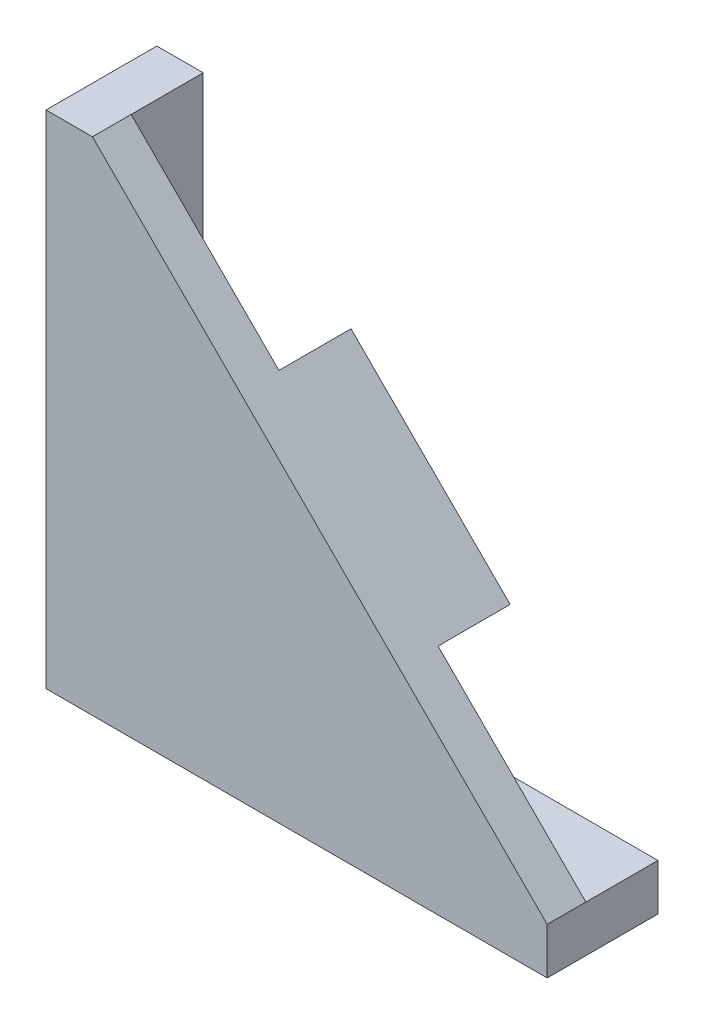
ISO-10303-21;
HEADER;
FILE_DESCRIPTION(('STEP AP214'),'2;1');
FILE_NAME('part.step','',(''),(''),'','','');
FILE_SCHEMA(('AUTOMOTIVE_DESIGN { 1 0 10303 214 1 1 1 1 }'));
ENDSEC;
DATA;
#1=APPLICATION_CONTEXT('core data for automotive mechanical design processes');
#2=APPLICATION_PROTOCOL_DEFINITION('international standard','automotive_design',2000,#1);
#3=PRODUCT_CONTEXT('',#1,'mechanical');
#4=PRODUCT('Part','Part','',(#3));
#5=PRODUCT_RELATED_PRODUCT_CATEGORY('part','',(#4));
#6=PRODUCT_DEFINITION_FORMATION('','',#4);
#7=PRODUCT_DEFINITION_CONTEXT('part definition',#1,'design');
#8=PRODUCT_DEFINITION('design','',#6,#7);
#9=PRODUCT_DEFINITION_SHAPE('','',#8);
#10=(LENGTH_UNIT() NAMED_UNIT(*) SI_UNIT(.MILLI.,.METRE.));
#11=(NAMED_UNIT(*) PLANE_ANGLE_UNIT() SI_UNIT($,.RADIAN.));
#12=(NAMED_UNIT(*) SI_UNIT($,.STERADIAN.) SOLID_ANGLE_UNIT());
#13=UNCERTAINTY_MEASURE_WITH_UNIT(LENGTH_MEASURE(1.E-05),#10,'distance_accuracy_value','');
#14=(GEOMETRIC_REPRESENTATION_CONTEXT(3) GLOBAL_UNCERTAINTY_ASSIGNED_CONTEXT((#13)) GLOBAL_UNIT_ASSIGNED_CONTEXT((#10,
#11,#12)) REPRESENTATION_CONTEXT('',''));
#15=CARTESIAN_POINT('',(0.,0.,0.));
#16=DIRECTION('',(0.,0.,1.));
#17=DIRECTION('',(1.,0.,0.));
#18=AXIS2_PLACEMENT_3D('',#15,#16,#17);
#19=CARTESIAN_POINT('',(0.,0.,-1.1));
#20=DIRECTION('',(0.,0.,-1.));
#21=DIRECTION('',(-1.,0.,0.));
#22=AXIS2_PLACEMENT_3D('',#19,#20,#21);
#23=PLANE('',#22);
#24=DIRECTION('',(0.707106781186548,-0.707106781186547,0.));
#25=VECTOR('',#24,1.);
#26=CARTESIAN_POINT('',(14.25,1.32,-1.1));
#27=LINE('',#26,#25);
#28=CARTESIAN_POINT('',(1.32,14.25,-1.1));
#29=VERTEX_POINT('',#28);
#30=CARTESIAN_POINT('',(5.52225830020305,10.0477416997969,-1.1));
#31=VERTEX_POINT('',#30);
#32=EDGE_CURVE('E57',#29,#31,#27,.T.);
#33=ORIENTED_EDGE('',*,*,#32,.T.);
#34=CARTESIAN_POINT('',(7.785,7.785,-1.1));
#35=DIRECTION('',(0.,0.,-1.));
#36=DIRECTION('',(-1.,0.,0.));
#37=AXIS2_PLACEMENT_3D('',#34,#35,#36);
#38=CIRCLE('',#37,3.2);
#39=CARTESIAN_POINT('',(10.047741699797,5.52225830020305,-1.1));
#40=VERTEX_POINT('',#39);
#41=EDGE_CURVE('E126',#40,#31,#38,.T.);
#42=ORIENTED_EDGE('',*,*,#41,.F.);
#43=CARTESIAN_POINT('',(14.25,1.32,-1.1));
#44=VERTEX_POINT('',#43);
#45=EDGE_CURVE('E136',#40,#44,#27,.T.);
#46=ORIENTED_EDGE('',*,*,#45,.T.);
#47=DIRECTION('',(-1.,0.,0.));
#48=VECTOR('',#47,1.);
#49=CARTESIAN_POINT('',(14.25,1.32,-1.1));
#50=LINE('',#49,#48);
#51=CARTESIAN_POINT('',(1.32,1.32,-1.1));
#52=VERTEX_POINT('',#51);
#53=EDGE_CURVE('E151',#44,#52,#50,.T.);
#54=ORIENTED_EDGE('',*,*,#53,.T.);
#55=DIRECTION('',(0.,1.,0.));
#56=VECTOR('',#55,1.);
#57=CARTESIAN_POINT('',(1.32,1.32,-1.1));
#58=LINE('',#57,#56);
#59=EDGE_CURVE('E154',#52,#29,#58,.T.);
#60=ORIENTED_EDGE('',*,*,#59,.T.);
#61=EDGE_LOOP('',(#33,#42,#46,#54,#60));
#62=FACE_BOUND('',#61,.T.);
#63=ADVANCED_FACE('F33',(#62),#23,.T.);
#64=CARTESIAN_POINT('',(14.25,1.32,-3.15));
#65=DIRECTION('',(0.707106781186548,0.707106781186548,0.));
#66=DIRECTION('',(-0.707106781186548,0.707106781186548,0.));
#67=AXIS2_PLACEMENT_3D('',#64,#65,#66);
#68=PLANE('',#67);
#69=DIRECTION('',(0.,0.,1.));
#70=VECTOR('',#69,1.);
#71=CARTESIAN_POINT('',(14.25,1.32,-3.15));
#72=LINE('',#71,#70);
#73=CARTESIAN_POINT('',(14.25,1.32,0.));
#74=VERTEX_POINT('',#73);
#75=EDGE_CURVE('E194',#44,#74,#72,.T.);
#76=ORIENTED_EDGE('',*,*,#75,.F.);
#77=ORIENTED_EDGE('',*,*,#45,.F.);
#78=DIRECTION('',(0.,0.,1.));
#79=VECTOR('',#78,1.);
#80=CARTESIAN_POINT('',(10.047741699797,5.52225830020305,-10.8754833995939));
#81=LINE('',#80,#79);
#82=CARTESIAN_POINT('',(10.047741699797,5.52225830020305,-3.15));
#83=VERTEX_POINT('',#82);
#84=EDGE_CURVE('E132',#83,#40,#81,.T.);
#85=ORIENTED_EDGE('',*,*,#84,.F.);
#86=DIRECTION('',(-0.707106781186547,0.707106781186548,0.));
#87=VECTOR('',#86,1.);
#88=CARTESIAN_POINT('',(10.047741699797,5.52225830020305,-3.15));
#89=LINE('',#88,#87);
#90=CARTESIAN_POINT('',(5.52225830020305,10.047741699797,-3.15));
#91=VERTEX_POINT('',#90);
#92=EDGE_CURVE('E118',#83,#91,#89,.T.);
#93=ORIENTED_EDGE('',*,*,#92,.T.);
#94=DIRECTION('',(0.,0.,1.));
#95=VECTOR('',#94,1.);
#96=CARTESIAN_POINT('',(5.52225830020305,10.047741699797,-10.8754833995939));
#97=LINE('',#96,#95);
#98=EDGE_CURVE('E125',#91,#31,#97,.T.);
#99=ORIENTED_EDGE('',*,*,#98,.T.);
#100=ORIENTED_EDGE('',*,*,#32,.F.);
#101=DIRECTION('',(0.,0.,1.));
#102=VECTOR('',#101,1.);
#103=CARTESIAN_POINT('',(1.32,14.25,-3.15));
#104=LINE('',#103,#102);
#105=CARTESIAN_POINT('',(1.32,14.25,0.));
#106=VERTEX_POINT('',#105);
#107=EDGE_CURVE('E191',#29,#106,#104,.T.);
#108=ORIENTED_EDGE('',*,*,#107,.T.);
#109=DIRECTION('',(-0.707106781186548,0.707106781186547,0.));
#110=VECTOR('',#109,1.);
#111=CARTESIAN_POINT('',(14.25,1.32,0.));
#112=LINE('',#111,#110);
#113=EDGE_CURVE('E185',#74,#106,#112,.T.);
#114=ORIENTED_EDGE('',*,*,#113,.F.);
#115=EDGE_LOOP('',(#76,#77,#85,#93,#99,#100,#108,#114));
#116=FACE_BOUND('',#115,.T.);
#117=ADVANCED_FACE('F135',(#116),#68,.T.);
#118=CARTESIAN_POINT('',(0.,14.25,-3.15));
#119=DIRECTION('',(-1.,0.,0.));
#120=DIRECTION('',(0.,0.,1.));
#121=AXIS2_PLACEMENT_3D('',#118,#119,#120);
#122=PLANE('',#121);
#123=DIRECTION('',(0.,-1.,0.));
#124=VECTOR('',#123,1.);
#125=CARTESIAN_POINT('',(0.,14.25,0.));
#126=LINE('',#125,#124);
#127=CARTESIAN_POINT('',(0.,14.25,0.));
#128=VERTEX_POINT('',#127);
#129=CARTESIAN_POINT('',(0.,0.,0.));
#130=VERTEX_POINT('',#129);
#131=EDGE_CURVE('E163',#128,#130,#126,.T.);
#132=ORIENTED_EDGE('',*,*,#131,.F.);
#133=DIRECTION('',(0.,0.,1.));
#134=VECTOR('',#133,1.);
#135=CARTESIAN_POINT('',(0.,14.25,-3.15));
#136=LINE('',#135,#134);
#137=CARTESIAN_POINT('',(0.,14.25,-3.15));
#138=VERTEX_POINT('',#137);
#139=EDGE_CURVE('E11',#138,#128,#136,.T.);
#140=ORIENTED_EDGE('',*,*,#139,.F.);
#141=DIRECTION('',(0.,-1.,0.));
#142=VECTOR('',#141,1.);
#143=CARTESIAN_POINT('',(0.,14.25,-3.15));
#144=LINE('',#143,#142);
#145=CARTESIAN_POINT('',(0.,0.,-3.15));
#146=VERTEX_POINT('',#145);
#147=EDGE_CURVE('E164',#138,#146,#144,.T.);
#148=ORIENTED_EDGE('',*,*,#147,.T.);
#149=DIRECTION('',(0.,0.,1.));
#150=VECTOR('',#149,1.);
#151=CARTESIAN_POINT('',(0.,0.,-3.15));
#152=LINE('',#151,#150);
#153=EDGE_CURVE('E37',#146,#130,#152,.T.);
#154=ORIENTED_EDGE('',*,*,#153,.T.);
#155=EDGE_LOOP('',(#132,#140,#148,#154));
#156=FACE_BOUND('',#155,.T.);
#157=ADVANCED_FACE('F35',(#156),#122,.T.);
#158=CARTESIAN_POINT('',(1.32,14.25,-3.15));
#159=DIRECTION('',(0.,1.,0.));
#160=DIRECTION('',(0.,0.,1.));
#161=AXIS2_PLACEMENT_3D('',#158,#159,#160);
#162=PLANE('',#161);
#163=DIRECTION('',(-1.,0.,0.));
#164=VECTOR('',#163,1.);
#165=CARTESIAN_POINT('',(1.32,14.25,0.));
#166=LINE('',#165,#164);
#167=EDGE_CURVE('E168',#106,#128,#166,.T.);
#168=ORIENTED_EDGE('',*,*,#167,.F.);
#169=ORIENTED_EDGE('',*,*,#107,.F.);
#170=CARTESIAN_POINT('',(1.32,14.25,-3.15));
#171=VERTEX_POINT('',#170);
#172=EDGE_CURVE('E42',#171,#29,#104,.T.);
#173=ORIENTED_EDGE('',*,*,#172,.F.);
#174=DIRECTION('',(-1.,0.,0.));
#175=VECTOR('',#174,1.);
#176=CARTESIAN_POINT('',(1.32,14.25,-3.15));
#177=LINE('',#176,#175);
#178=EDGE_CURVE('E174',#171,#138,#177,.T.);
#179=ORIENTED_EDGE('',*,*,#178,.T.);
#180=ORIENTED_EDGE('',*,*,#139,.T.);
#181=EDGE_LOOP('',(#168,#169,#173,#179,#180));
#182=FACE_BOUND('',#181,.T.);
#183=ADVANCED_FACE('F210',(#182),#162,.T.);
#184=CARTESIAN_POINT('',(14.25,0.,-3.15));
#185=DIRECTION('',(1.,0.,0.));
#186=DIRECTION('',(0.,0.,-1.));
#187=AXIS2_PLACEMENT_3D('',#184,#185,#186);
#188=PLANE('',#187);
#189=DIRECTION('',(0.,1.,0.));
#190=VECTOR('',#189,1.);
#191=CARTESIAN_POINT('',(14.25,0.,0.));
#192=LINE('',#191,#190);
#193=CARTESIAN_POINT('',(14.25,0.,0.));
#194=VERTEX_POINT('',#193);
#195=EDGE_CURVE('E182',#194,#74,#192,.T.);
#196=ORIENTED_EDGE('',*,*,#195,.F.);
#197=DIRECTION('',(0.,0.,1.));
#198=VECTOR('',#197,1.);
#199=CARTESIAN_POINT('',(14.25,0.,-3.15));
#200=LINE('',#199,#198);
#201=CARTESIAN_POINT('',(14.25,0.,-3.15));
#202=VERTEX_POINT('',#201);
#203=EDGE_CURVE('E195',#202,#194,#200,.T.);
#204=ORIENTED_EDGE('',*,*,#203,.F.);
#205=DIRECTION('',(0.,1.,0.));
#206=VECTOR('',#205,1.);
#207=CARTESIAN_POINT('',(14.25,0.,-3.15));
#208=LINE('',#207,#206);
#209=CARTESIAN_POINT('',(14.25,1.32,-3.15));
#210=VERTEX_POINT('',#209);
#211=EDGE_CURVE('E171',#202,#210,#208,.T.);
#212=ORIENTED_EDGE('',*,*,#211,.T.);
#213=EDGE_CURVE('E192',#210,#44,#72,.T.);
#214=ORIENTED_EDGE('',*,*,#213,.T.);
#215=ORIENTED_EDGE('',*,*,#75,.T.);
#216=EDGE_LOOP('',(#196,#204,#212,#214,#215));
#217=FACE_BOUND('',#216,.T.);
#218=ADVANCED_FACE('F219',(#217),#188,.T.);
#219=CARTESIAN_POINT('',(0.,0.,-3.15));
#220=DIRECTION('',(0.,-1.,0.));
#221=DIRECTION('',(0.,0.,-1.));
#222=AXIS2_PLACEMENT_3D('',#219,#220,#221);
#223=PLANE('',#222);
#224=DIRECTION('',(1.,0.,0.));
#225=VECTOR('',#224,1.);
#226=CARTESIAN_POINT('',(0.,0.,0.));
#227=LINE('',#226,#225);
#228=EDGE_CURVE('E179',#130,#194,#227,.T.);
#229=ORIENTED_EDGE('',*,*,#228,.F.);
#230=ORIENTED_EDGE('',*,*,#153,.F.);
#231=DIRECTION('',(1.,0.,0.));
#232=VECTOR('',#231,1.);
#233=CARTESIAN_POINT('',(0.,0.,-3.15));
#234=LINE('',#233,#232);
#235=EDGE_CURVE('E167',#146,#202,#234,.T.);
#236=ORIENTED_EDGE('',*,*,#235,.T.);
#237=ORIENTED_EDGE('',*,*,#203,.T.);
#238=EDGE_LOOP('',(#229,#230,#236,#237));
#239=FACE_BOUND('',#238,.T.);
#240=ADVANCED_FACE('F203',(#239),#223,.T.);
#241=CARTESIAN_POINT('',(0.,0.,-3.15));
#242=DIRECTION('',(0.,0.,1.));
#243=DIRECTION('',(1.,0.,0.));
#244=AXIS2_PLACEMENT_3D('',#241,#242,#243);
#245=PLANE('',#244);
#246=ORIENTED_EDGE('',*,*,#178,.F.);
#247=DIRECTION('',(0.,1.,0.));
#248=VECTOR('',#247,1.);
#249=CARTESIAN_POINT('',(1.32,1.32,-3.15));
#250=LINE('',#249,#248);
#251=CARTESIAN_POINT('',(1.32,1.32,-3.15));
#252=VERTEX_POINT('',#251);
#253=EDGE_CURVE('E160',#252,#171,#250,.T.);
#254=ORIENTED_EDGE('',*,*,#253,.F.);
#255=DIRECTION('',(-1.,0.,0.));
#256=VECTOR('',#255,1.);
#257=CARTESIAN_POINT('',(14.25,1.32,-3.15));
#258=LINE('',#257,#256);
#259=EDGE_CURVE('E157',#210,#252,#258,.T.);
#260=ORIENTED_EDGE('',*,*,#259,.F.);
#261=ORIENTED_EDGE('',*,*,#211,.F.);
#262=ORIENTED_EDGE('',*,*,#235,.F.);
#263=ORIENTED_EDGE('',*,*,#147,.F.);
#264=EDGE_LOOP('',(#246,#254,#260,#261,#262,#263));
#265=FACE_BOUND('',#264,.T.);
#266=ADVANCED_FACE('F214',(#265),#245,.F.);
#267=CARTESIAN_POINT('',(0.,0.,0.));
#268=DIRECTION('',(0.,0.,1.));
#269=DIRECTION('',(1.,0.,0.));
#270=AXIS2_PLACEMENT_3D('',#267,#268,#269);
#271=PLANE('',#270);
#272=ORIENTED_EDGE('',*,*,#131,.T.);
#273=ORIENTED_EDGE('',*,*,#228,.T.);
#274=ORIENTED_EDGE('',*,*,#195,.T.);
#275=ORIENTED_EDGE('',*,*,#113,.T.);
#276=ORIENTED_EDGE('',*,*,#167,.T.);
#277=EDGE_LOOP('',(#272,#273,#274,#275,#276));
#278=FACE_BOUND('',#277,.T.);
#279=ADVANCED_FACE('F205',(#278),#271,.T.);
#280=CARTESIAN_POINT('',(1.32,1.32,-1.1));
#281=DIRECTION('',(-1.,0.,0.));
#282=DIRECTION('',(0.,-1.,0.));
#283=AXIS2_PLACEMENT_3D('',#280,#281,#282);
#284=PLANE('',#283);
#285=ORIENTED_EDGE('',*,*,#253,.T.);
#286=ORIENTED_EDGE('',*,*,#172,.T.);
#287=ORIENTED_EDGE('',*,*,#59,.F.);
#288=DIRECTION('',(0.,0.,-1.));
#289=VECTOR('',#288,1.);
#290=CARTESIAN_POINT('',(1.32,1.32,-1.1));
#291=LINE('',#290,#289);
#292=EDGE_CURVE('E156',#52,#252,#291,.T.);
#293=ORIENTED_EDGE('',*,*,#292,.T.);
#294=EDGE_LOOP('',(#285,#286,#287,#293));
#295=FACE_BOUND('',#294,.T.);
#296=ADVANCED_FACE('F225',(#295),#284,.F.);
#297=CARTESIAN_POINT('',(14.25,1.32,-1.1));
#298=DIRECTION('',(0.,-1.,0.));
#299=DIRECTION('',(0.,0.,-1.));
#300=AXIS2_PLACEMENT_3D('',#297,#298,#299);
#301=PLANE('',#300);
#302=ORIENTED_EDGE('',*,*,#259,.T.);
#303=ORIENTED_EDGE('',*,*,#292,.F.);
#304=ORIENTED_EDGE('',*,*,#53,.F.);
#305=ORIENTED_EDGE('',*,*,#213,.F.);
#306=EDGE_LOOP('',(#302,#303,#304,#305));
#307=FACE_BOUND('',#306,.T.);
#308=ADVANCED_FACE('F223',(#307),#301,.F.);
#309=CARTESIAN_POINT('',(7.785,7.785,-10.8754833995939));
#310=DIRECTION('',(0.,0.,1.));
#311=DIRECTION('',(1.,0.,0.));
#312=AXIS2_PLACEMENT_3D('',#309,#310,#311);
#313=CYLINDRICAL_SURFACE('',#312,3.2);
#314=ORIENTED_EDGE('',*,*,#98,.F.);
#315=CARTESIAN_POINT('',(7.785,7.785,-3.15));
#316=DIRECTION('',(0.,0.,1.));
#317=DIRECTION('',(1.,0.,0.));
#318=AXIS2_PLACEMENT_3D('',#315,#316,#317);
#319=CIRCLE('',#318,3.2);
#320=EDGE_CURVE('E121',#91,#83,#319,.T.);
#321=ORIENTED_EDGE('',*,*,#320,.T.);
#322=ORIENTED_EDGE('',*,*,#84,.T.);
#323=ORIENTED_EDGE('',*,*,#41,.T.);
#324=EDGE_LOOP('',(#314,#321,#322,#323));
#325=FACE_BOUND('',#324,.T.);
#326=ADVANCED_FACE('F130',(#325),#313,.T.);
#327=CARTESIAN_POINT('',(7.785,7.785,-10.8754833995939));
#328=DIRECTION('',(0.,0.,1.));
#329=DIRECTION('',(1.,0.,0.));
#330=AXIS2_PLACEMENT_3D('',#327,#328,#329);
#331=CYLINDRICAL_SURFACE('',#330,2.45);
#332=CARTESIAN_POINT('',(7.785,7.785,-3.15));
#333=DIRECTION('',(0.,0.,1.));
#334=DIRECTION('',(1.,0.,0.));
#335=AXIS2_PLACEMENT_3D('',#332,#333,#334);
#336=CIRCLE('',#335,2.45);
#337=CARTESIAN_POINT('',(5.49635915341998,8.65942728420693,-3.15));
#338=VERTEX_POINT('',#337);
#339=CARTESIAN_POINT('',(8.65942728420693,5.49635915341998,-3.15));
#340=VERTEX_POINT('',#339);
#341=EDGE_CURVE('E146',#338,#340,#336,.T.);
#342=ORIENTED_EDGE('',*,*,#341,.F.);
#343=DIRECTION('',(0.,0.,1.));
#344=VECTOR('',#343,1.);
#345=CARTESIAN_POINT('',(5.49635915341998,8.65942728420693,-10.8754833995939));
#346=LINE('',#345,#344);
#347=CARTESIAN_POINT('',(5.49635915341998,8.65942728420693,-1.1));
#348=VERTEX_POINT('',#347);
#349=EDGE_CURVE('E142',#338,#348,#346,.T.);
#350=ORIENTED_EDGE('',*,*,#349,.T.);
#351=CARTESIAN_POINT('',(7.785,7.785,-1.1));
#352=DIRECTION('',(0.,0.,-1.));
#353=DIRECTION('',(-1.,0.,0.));
#354=AXIS2_PLACEMENT_3D('',#351,#352,#353);
#355=CIRCLE('',#354,2.45);
#356=CARTESIAN_POINT('',(8.65942728420693,5.49635915341998,-1.1));
#357=VERTEX_POINT('',#356);
#358=EDGE_CURVE('E249',#357,#348,#355,.T.);
#359=ORIENTED_EDGE('',*,*,#358,.F.);
#360=DIRECTION('',(0.,0.,1.));
#361=VECTOR('',#360,1.);
#362=CARTESIAN_POINT('',(8.65942728420693,5.49635915341998,-10.8754833995939));
#363=LINE('',#362,#361);
#364=EDGE_CURVE('E145',#340,#357,#363,.T.);
#365=ORIENTED_EDGE('',*,*,#364,.F.);
#366=EDGE_LOOP('',(#342,#350,#359,#365));
#367=FACE_BOUND('',#366,.T.);
#368=ADVANCED_FACE('F255',(#367),#331,.F.);
#369=CARTESIAN_POINT('',(8.65942728420693,5.49635915341998,-10.8754833995939));
#370=DIRECTION('',(-0.707106781186547,-0.707106781186548,0.));
#371=DIRECTION('',(0.707106781186548,-0.707106781186547,0.));
#372=AXIS2_PLACEMENT_3D('',#369,#370,#371);
#373=PLANE('',#372);
#374=DIRECTION('',(-0.707106781186548,0.707106781186547,0.));
#375=VECTOR('',#374,1.);
#376=CARTESIAN_POINT('',(8.65942728420693,5.49635915341998,-3.15));
#377=LINE('',#376,#375);
#378=EDGE_CURVE('E149',#340,#338,#377,.T.);
#379=ORIENTED_EDGE('',*,*,#378,.F.);
#380=ORIENTED_EDGE('',*,*,#364,.T.);
#381=DIRECTION('',(0.707106781186548,-0.707106781186547,0.));
#382=VECTOR('',#381,1.);
#383=CARTESIAN_POINT('',(8.65942728420693,5.49635915341998,-1.1));
#384=LINE('',#383,#382);
#385=EDGE_CURVE('E49',#348,#357,#384,.T.);
#386=ORIENTED_EDGE('',*,*,#385,.F.);
#387=ORIENTED_EDGE('',*,*,#349,.F.);
#388=EDGE_LOOP('',(#379,#380,#386,#387));
#389=FACE_BOUND('',#388,.T.);
#390=ADVANCED_FACE('F246',(#389),#373,.T.);
#391=CARTESIAN_POINT('',(0.,0.,-3.15));
#392=DIRECTION('',(0.,0.,1.));
#393=DIRECTION('',(1.,0.,0.));
#394=AXIS2_PLACEMENT_3D('',#391,#392,#393);
#395=PLANE('',#394);
#396=ORIENTED_EDGE('',*,*,#341,.T.);
#397=ORIENTED_EDGE('',*,*,#378,.T.);
#398=EDGE_LOOP('',(#396,#397));
#399=FACE_BOUND('',#398,.T.);
#400=ORIENTED_EDGE('',*,*,#92,.F.);
#401=ORIENTED_EDGE('',*,*,#320,.F.);
#402=EDGE_LOOP('',(#400,#401));
#403=FACE_BOUND('',#402,.T.);
#404=ADVANCED_FACE('F120',(#399,#403),#395,.F.);
#405=ORIENTED_EDGE('',*,*,#358,.T.);
#406=ORIENTED_EDGE('',*,*,#385,.T.);
#407=EDGE_LOOP('',(#405,#406));
#408=FACE_BOUND('',#407,.T.);
#409=ADVANCED_FACE('F236',(#408),#23,.T.);
#410=CLOSED_SHELL('',(#63,#117,#157,#183,#218,#240,#266,#279,#296,#308,#326,#368,#390,#404,#409));
#411=MANIFOLD_SOLID_BREP('B2',#410);
#412=ADVANCED_BREP_SHAPE_REPRESENTATION('',(#18,#411),#14);
#413=SHAPE_DEFINITION_REPRESENTATION(#9,#412);
ENDSEC;
END-ISO-10303-21;
